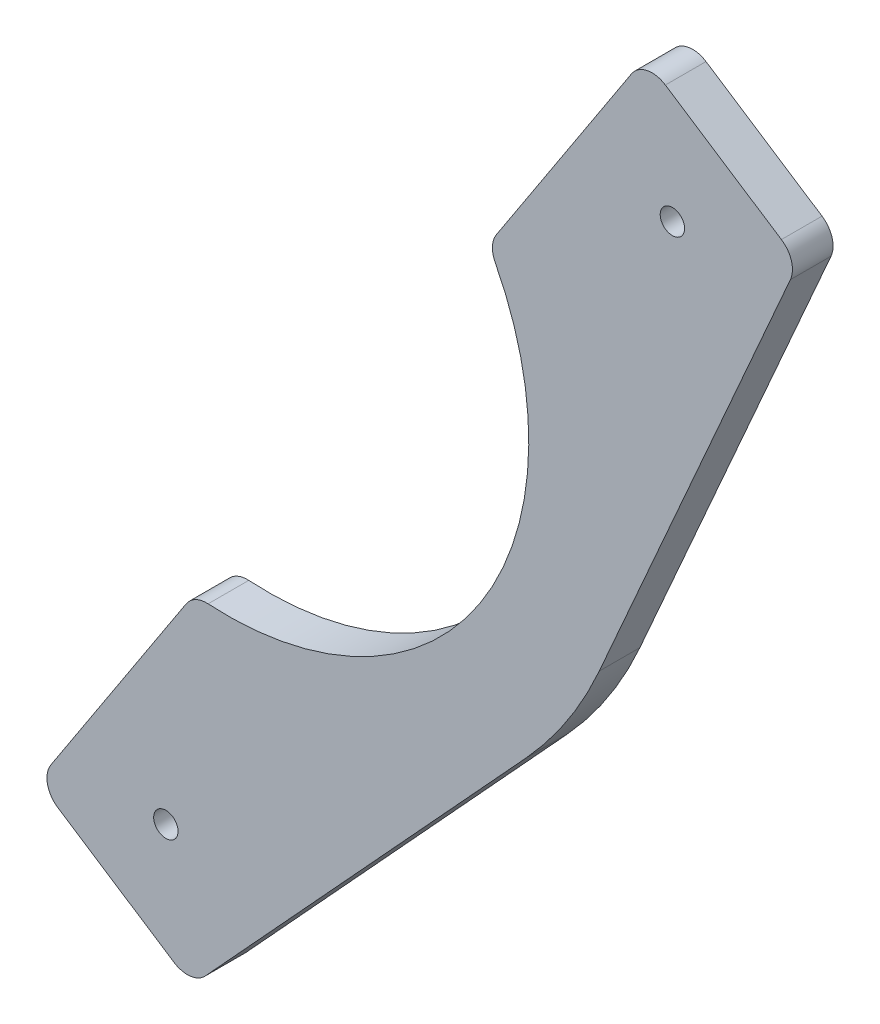
ISO-10303-21;
HEADER;
FILE_DESCRIPTION(('STEP AP214'),'2;1');
FILE_NAME('part.step','',(''),(''),'','','');
FILE_SCHEMA(('AUTOMOTIVE_DESIGN { 1 0 10303 214 1 1 1 1 }'));
ENDSEC;
DATA;
#1=APPLICATION_CONTEXT('core data for automotive mechanical design processes');
#2=APPLICATION_PROTOCOL_DEFINITION('international standard','automotive_design',2000,#1);
#3=PRODUCT_CONTEXT('',#1,'mechanical');
#4=PRODUCT('Part','Part','',(#3));
#5=PRODUCT_RELATED_PRODUCT_CATEGORY('part','',(#4));
#6=PRODUCT_DEFINITION_FORMATION('','',#4);
#7=PRODUCT_DEFINITION_CONTEXT('part definition',#1,'design');
#8=PRODUCT_DEFINITION('design','',#6,#7);
#9=PRODUCT_DEFINITION_SHAPE('','',#8);
#10=(LENGTH_UNIT() NAMED_UNIT(*) SI_UNIT(.MILLI.,.METRE.));
#11=(NAMED_UNIT(*) PLANE_ANGLE_UNIT() SI_UNIT($,.RADIAN.));
#12=(NAMED_UNIT(*) SI_UNIT($,.STERADIAN.) SOLID_ANGLE_UNIT());
#13=UNCERTAINTY_MEASURE_WITH_UNIT(LENGTH_MEASURE(1.E-05),#10,'distance_accuracy_value','');
#14=(GEOMETRIC_REPRESENTATION_CONTEXT(3) GLOBAL_UNCERTAINTY_ASSIGNED_CONTEXT((#13)) GLOBAL_UNIT_ASSIGNED_CONTEXT((#10,
#11,#12)) REPRESENTATION_CONTEXT('',''));
#15=CARTESIAN_POINT('',(0.,0.,0.));
#16=DIRECTION('',(0.,0.,1.));
#17=DIRECTION('',(1.,0.,0.));
#18=AXIS2_PLACEMENT_3D('',#15,#16,#17);
#19=CARTESIAN_POINT('',(-42.9886000873194,-65.7996407519994,5.));
#20=DIRECTION('',(0.546944138603989,0.837169104331222,0.));
#21=DIRECTION('',(-0.837169104331222,0.546944138603989,0.));
#22=AXIS2_PLACEMENT_3D('',#19,#20,#21);
#23=PLANE('',#22);
#24=DIRECTION('',(0.837169104331222,-0.546944138603989,0.));
#25=VECTOR('',#24,1.);
#26=CARTESIAN_POINT('',(-42.9886000873194,-65.7996407519994,0.));
#27=LINE('',#26,#25);
#28=CARTESIAN_POINT('',(-86.2942272599276,-37.506959108487,0.));
#29=VERTEX_POINT('',#28);
#30=CARTESIAN_POINT('',(-72.0136219777785,-46.8368463611088,0.));
#31=VERTEX_POINT('',#30);
#32=EDGE_CURVE('E173',#29,#31,#27,.T.);
#33=ORIENTED_EDGE('',*,*,#32,.T.);
#34=DIRECTION('',(0.,0.,-1.));
#35=VECTOR('',#34,1.);
#36=CARTESIAN_POINT('',(-72.0136219777785,-46.8368463611088,5.));
#37=LINE('',#36,#35);
#38=CARTESIAN_POINT('',(-72.0136219777785,-46.8368463611088,5.));
#39=VERTEX_POINT('',#38);
#40=EDGE_CURVE('E11',#39,#31,#37,.T.);
#41=ORIENTED_EDGE('',*,*,#40,.F.);
#42=DIRECTION('',(0.837169104331222,-0.546944138603989,0.));
#43=VECTOR('',#42,1.);
#44=CARTESIAN_POINT('',(-42.9886000873194,-65.7996407519994,5.));
#45=LINE('',#44,#43);
#46=CARTESIAN_POINT('',(-86.2942272599276,-37.506959108487,5.));
#47=VERTEX_POINT('',#46);
#48=EDGE_CURVE('E207',#47,#39,#45,.T.);
#49=ORIENTED_EDGE('',*,*,#48,.F.);
#50=DIRECTION('',(0.,0.,-1.));
#51=VECTOR('',#50,1.);
#52=CARTESIAN_POINT('',(-86.2942272599276,-37.506959108487,5.));
#53=LINE('',#52,#51);
#54=EDGE_CURVE('E172',#47,#29,#53,.T.);
#55=ORIENTED_EDGE('',*,*,#54,.T.);
#56=EDGE_LOOP('',(#33,#41,#49,#55));
#57=FACE_BOUND('',#56,.T.);
#58=ADVANCED_FACE('F35',(#57),#23,.F.);
#59=CARTESIAN_POINT('',(-70.3727895619665,-44.3253390481151,5.));
#60=DIRECTION('',(0.,0.,-1.));
#61=DIRECTION('',(-1.,0.,0.));
#62=AXIS2_PLACEMENT_3D('',#59,#60,#61);
#63=CYLINDRICAL_SURFACE('',#62,3.);
#64=CARTESIAN_POINT('',(-70.3727895619665,-44.3253390481151,0.));
#65=DIRECTION('',(0.,0.,1.));
#66=DIRECTION('',(1.,0.,0.));
#67=AXIS2_PLACEMENT_3D('',#64,#65,#66);
#68=CIRCLE('',#67,3.);
#69=CARTESIAN_POINT('',(-68.1635245012134,-46.3549074483756,0.));
#70=VERTEX_POINT('',#69);
#71=EDGE_CURVE('E176',#31,#70,#68,.T.);
#72=ORIENTED_EDGE('',*,*,#71,.T.);
#73=DIRECTION('',(0.,0.,-1.));
#74=VECTOR('',#73,1.);
#75=CARTESIAN_POINT('',(-68.1635245012134,-46.3549074483756,5.));
#76=LINE('',#75,#74);
#77=CARTESIAN_POINT('',(-68.1635245012134,-46.3549074483756,5.));
#78=VERTEX_POINT('',#77);
#79=EDGE_CURVE('E43',#78,#70,#76,.T.);
#80=ORIENTED_EDGE('',*,*,#79,.F.);
#81=CARTESIAN_POINT('',(-70.3727895619665,-44.3253390481151,5.));
#82=DIRECTION('',(0.,0.,1.));
#83=DIRECTION('',(1.,0.,0.));
#84=AXIS2_PLACEMENT_3D('',#81,#82,#83);
#85=CIRCLE('',#84,3.);
#86=EDGE_CURVE('E112',#39,#78,#85,.T.);
#87=ORIENTED_EDGE('',*,*,#86,.F.);
#88=ORIENTED_EDGE('',*,*,#40,.T.);
#89=EDGE_LOOP('',(#72,#80,#87,#88));
#90=FACE_BOUND('',#89,.T.);
#91=ADVANCED_FACE('F294',(#90),#63,.T.);
#92=CARTESIAN_POINT('',(-13.8719354868806,12.7436233952964,5.));
#93=DIRECTION('',(-0.736421686917699,0.676522800086805,0.));
#94=DIRECTION('',(-0.676522800086805,-0.736421686917699,0.));
#95=AXIS2_PLACEMENT_3D('',#92,#93,#94);
#96=PLANE('',#95);
#97=DIRECTION('',(0.676522800086805,0.736421686917699,0.));
#98=VECTOR('',#97,1.);
#99=CARTESIAN_POINT('',(-13.8719354868806,12.7436233952964,0.));
#100=LINE('',#99,#98);
#101=CARTESIAN_POINT('',(-28.6392294633598,-3.33115714421098,0.));
#102=VERTEX_POINT('',#101);
#103=EDGE_CURVE('E178',#70,#102,#100,.T.);
#104=ORIENTED_EDGE('',*,*,#103,.T.);
#105=DIRECTION('',(0.,0.,-1.));
#106=VECTOR('',#105,1.);
#107=CARTESIAN_POINT('',(-28.6392294633598,-3.33115714421098,5.));
#108=LINE('',#107,#106);
#109=CARTESIAN_POINT('',(-28.6392294633598,-3.33115714421098,5.));
#110=VERTEX_POINT('',#109);
#111=EDGE_CURVE('E231',#110,#102,#108,.T.);
#112=ORIENTED_EDGE('',*,*,#111,.F.);
#113=DIRECTION('',(0.676522800086805,0.736421686917699,0.));
#114=VECTOR('',#113,1.);
#115=CARTESIAN_POINT('',(-13.8719354868806,12.7436233952964,5.));
#116=LINE('',#115,#114);
#117=EDGE_CURVE('E239',#78,#110,#116,.T.);
#118=ORIENTED_EDGE('',*,*,#117,.F.);
#119=ORIENTED_EDGE('',*,*,#79,.T.);
#120=EDGE_LOOP('',(#104,#112,#118,#119));
#121=FACE_BOUND('',#120,.T.);
#122=ADVANCED_FACE('F237',(#121),#96,.F.);
#123=CARTESIAN_POINT('',(-65.4603138092448,30.4949828601293,5.));
#124=DIRECTION('',(0.,0.,-1.));
#125=DIRECTION('',(-1.,0.,0.));
#126=AXIS2_PLACEMENT_3D('',#123,#124,#125);
#127=CYLINDRICAL_SURFACE('',#126,50.);
#128=CARTESIAN_POINT('',(-65.4603138092448,30.4949828601293,0.));
#129=DIRECTION('',(0.,0.,1.));
#130=DIRECTION('',(1.,0.,0.));
#131=AXIS2_PLACEMENT_3D('',#128,#129,#130);
#132=CIRCLE('',#131,50.);
#133=CARTESIAN_POINT('',(-19.6921826188176,10.3634611258975,0.));
#134=VERTEX_POINT('',#133);
#135=EDGE_CURVE('E180',#102,#134,#132,.T.);
#136=ORIENTED_EDGE('',*,*,#135,.T.);
#137=DIRECTION('',(0.,0.,-1.));
#138=VECTOR('',#137,1.);
#139=CARTESIAN_POINT('',(-19.6921826188176,10.3634611258975,5.));
#140=LINE('',#139,#138);
#141=CARTESIAN_POINT('',(-19.6921826188176,10.3634611258975,5.));
#142=VERTEX_POINT('',#141);
#143=EDGE_CURVE('E228',#142,#134,#140,.T.);
#144=ORIENTED_EDGE('',*,*,#143,.F.);
#145=CARTESIAN_POINT('',(-65.4603138092448,30.4949828601293,5.));
#146=DIRECTION('',(0.,0.,1.));
#147=DIRECTION('',(1.,0.,0.));
#148=AXIS2_PLACEMENT_3D('',#145,#146,#147);
#149=CIRCLE('',#148,50.);
#150=EDGE_CURVE('E258',#110,#142,#149,.T.);
#151=ORIENTED_EDGE('',*,*,#150,.F.);
#152=ORIENTED_EDGE('',*,*,#111,.T.);
#153=EDGE_LOOP('',(#136,#144,#151,#152));
#154=FACE_BOUND('',#153,.T.);
#155=ADVANCED_FACE('F249',(#154),#127,.T.);
#156=CARTESIAN_POINT('',(-20.3193410911798,8.93764386184757,5.));
#157=DIRECTION('',(-0.915362623808544,0.402630434684635,0.));
#158=DIRECTION('',(-0.402630434684635,-0.915362623808544,0.));
#159=AXIS2_PLACEMENT_3D('',#156,#157,#158);
#160=PLANE('',#159);
#161=DIRECTION('',(0.402630434684635,0.915362623808544,0.));
#162=VECTOR('',#161,1.);
#163=CARTESIAN_POINT('',(-20.3193410911798,8.93764386184757,0.));
#164=LINE('',#163,#162);
#165=CARTESIAN_POINT('',(3.83057831348635,63.8414258085224,0.));
#166=VERTEX_POINT('',#165);
#167=EDGE_CURVE('E182',#134,#166,#164,.T.);
#168=ORIENTED_EDGE('',*,*,#167,.T.);
#169=DIRECTION('',(0.,0.,-1.));
#170=VECTOR('',#169,1.);
#171=CARTESIAN_POINT('',(3.83057831348635,63.8414258085224,5.));
#172=LINE('',#171,#170);
#173=CARTESIAN_POINT('',(3.83057831348635,63.8414258085224,5.));
#174=VERTEX_POINT('',#173);
#175=EDGE_CURVE('E225',#174,#166,#172,.T.);
#176=ORIENTED_EDGE('',*,*,#175,.F.);
#177=DIRECTION('',(0.402630434684635,0.915362623808544,0.));
#178=VECTOR('',#177,1.);
#179=CARTESIAN_POINT('',(-20.3193410911798,8.93764386184757,5.));
#180=LINE('',#179,#178);
#181=EDGE_CURVE('E255',#142,#174,#180,.T.);
#182=ORIENTED_EDGE('',*,*,#181,.F.);
#183=ORIENTED_EDGE('',*,*,#143,.T.);
#184=EDGE_LOOP('',(#168,#176,#182,#183));
#185=FACE_BOUND('',#184,.T.);
#186=ADVANCED_FACE('F253',(#185),#160,.F.);
#187=CARTESIAN_POINT('',(1.08449044206071,65.0493171125763,5.));
#188=DIRECTION('',(0.,0.,-1.));
#189=DIRECTION('',(-1.,0.,0.));
#190=AXIS2_PLACEMENT_3D('',#187,#188,#189);
#191=CYLINDRICAL_SURFACE('',#190,3.);
#192=CARTESIAN_POINT('',(1.08449044206071,65.0493171125763,0.));
#193=DIRECTION('',(0.,0.,1.));
#194=DIRECTION('',(1.,0.,0.));
#195=AXIS2_PLACEMENT_3D('',#192,#193,#194);
#196=CIRCLE('',#195,3.);
#197=CARTESIAN_POINT('',(2.72532285787266,67.5608244255699,0.));
#198=VERTEX_POINT('',#197);
#199=EDGE_CURVE('E184',#166,#198,#196,.T.);
#200=ORIENTED_EDGE('',*,*,#199,.T.);
#201=DIRECTION('',(0.,0.,-1.));
#202=VECTOR('',#201,1.);
#203=CARTESIAN_POINT('',(2.72532285787266,67.5608244255699,5.));
#204=LINE('',#203,#202);
#205=CARTESIAN_POINT('',(2.72532285787266,67.5608244255699,5.));
#206=VERTEX_POINT('',#205);
#207=EDGE_CURVE('E222',#206,#198,#204,.T.);
#208=ORIENTED_EDGE('',*,*,#207,.F.);
#209=CARTESIAN_POINT('',(1.08449044206071,65.0493171125763,5.));
#210=DIRECTION('',(0.,0.,1.));
#211=DIRECTION('',(1.,0.,0.));
#212=AXIS2_PLACEMENT_3D('',#209,#210,#211);
#213=CIRCLE('',#212,3.);
#214=EDGE_CURVE('E257',#174,#206,#213,.T.);
#215=ORIENTED_EDGE('',*,*,#214,.F.);
#216=ORIENTED_EDGE('',*,*,#175,.T.);
#217=EDGE_LOOP('',(#200,#208,#215,#216));
#218=FACE_BOUND('',#217,.T.);
#219=ADVANCED_FACE('F307',(#218),#191,.T.);
#220=CARTESIAN_POINT('',(31.7503447483318,48.5980300346792,5.));
#221=DIRECTION('',(-0.546944138603989,-0.837169104331222,0.));
#222=DIRECTION('',(0.837169104331222,-0.546944138603989,0.));
#223=AXIS2_PLACEMENT_3D('',#220,#221,#222);
#224=PLANE('',#223);
#225=DIRECTION('',(-0.837169104331222,0.546944138603989,0.));
#226=VECTOR('',#225,1.);
#227=CARTESIAN_POINT('',(31.7503447483318,48.5980300346792,0.));
#228=LINE('',#227,#226);
#229=CARTESIAN_POINT('',(-11.5552824242765,76.8907116781917,0.));
#230=VERTEX_POINT('',#229);
#231=EDGE_CURVE('E186',#198,#230,#228,.T.);
#232=ORIENTED_EDGE('',*,*,#231,.T.);
#233=DIRECTION('',(0.,0.,-1.));
#234=VECTOR('',#233,1.);
#235=CARTESIAN_POINT('',(-11.5552824242765,76.8907116781917,5.));
#236=LINE('',#235,#234);
#237=CARTESIAN_POINT('',(-11.5552824242765,76.8907116781917,5.));
#238=VERTEX_POINT('',#237);
#239=EDGE_CURVE('E219',#238,#230,#236,.T.);
#240=ORIENTED_EDGE('',*,*,#239,.F.);
#241=DIRECTION('',(-0.837169104331222,0.546944138603989,0.));
#242=VECTOR('',#241,1.);
#243=CARTESIAN_POINT('',(31.7503447483318,48.5980300346792,5.));
#244=LINE('',#243,#242);
#245=EDGE_CURVE('E260',#206,#238,#244,.T.);
#246=ORIENTED_EDGE('',*,*,#245,.F.);
#247=ORIENTED_EDGE('',*,*,#207,.T.);
#248=EDGE_LOOP('',(#232,#240,#246,#247));
#249=FACE_BOUND('',#248,.T.);
#250=ADVANCED_FACE('F310',(#249),#224,.F.);
#251=CARTESIAN_POINT('',(-13.1961148400884,74.379204365198,5.));
#252=DIRECTION('',(0.,0.,-1.));
#253=DIRECTION('',(-1.,0.,0.));
#254=AXIS2_PLACEMENT_3D('',#251,#252,#253);
#255=CYLINDRICAL_SURFACE('',#254,3.);
#256=CARTESIAN_POINT('',(-13.1961148400884,74.379204365198,0.));
#257=DIRECTION('',(0.,0.,1.));
#258=DIRECTION('',(1.,0.,0.));
#259=AXIS2_PLACEMENT_3D('',#256,#257,#258);
#260=CIRCLE('',#259,3.);
#261=CARTESIAN_POINT('',(-15.7076221530821,76.02003678101,0.));
#262=VERTEX_POINT('',#261);
#263=EDGE_CURVE('E188',#230,#262,#260,.T.);
#264=ORIENTED_EDGE('',*,*,#263,.T.);
#265=DIRECTION('',(0.,0.,-1.));
#266=VECTOR('',#265,1.);
#267=CARTESIAN_POINT('',(-15.7076221530821,76.02003678101,5.));
#268=LINE('',#267,#266);
#269=CARTESIAN_POINT('',(-15.7076221530821,76.02003678101,5.));
#270=VERTEX_POINT('',#269);
#271=EDGE_CURVE('E216',#270,#262,#268,.T.);
#272=ORIENTED_EDGE('',*,*,#271,.F.);
#273=CARTESIAN_POINT('',(-13.1961148400884,74.379204365198,5.));
#274=DIRECTION('',(0.,0.,1.));
#275=DIRECTION('',(1.,0.,0.));
#276=AXIS2_PLACEMENT_3D('',#273,#274,#275);
#277=CIRCLE('',#276,3.);
#278=EDGE_CURVE('E266',#238,#270,#277,.T.);
#279=ORIENTED_EDGE('',*,*,#278,.F.);
#280=ORIENTED_EDGE('',*,*,#239,.T.);
#281=EDGE_LOOP('',(#264,#272,#279,#280));
#282=FACE_BOUND('',#281,.T.);
#283=ADVANCED_FACE('F314',(#282),#255,.T.);
#284=CARTESIAN_POINT('',(-45.8171344856019,29.9335140593244,5.));
#285=DIRECTION('',(0.837169104331222,-0.546944138603989,0.));
#286=DIRECTION('',(0.546944138603989,0.837169104331222,0.));
#287=AXIS2_PLACEMENT_3D('',#284,#285,#286);
#288=PLANE('',#287);
#289=DIRECTION('',(-0.546944138603989,-0.837169104331222,0.));
#290=VECTOR('',#289,1.);
#291=CARTESIAN_POINT('',(-45.8171344856019,29.9335140593244,0.));
#292=LINE('',#291,#290);
#293=CARTESIAN_POINT('',(-32.3489446868555,50.5483293484286,0.));
#294=VERTEX_POINT('',#293);
#295=EDGE_CURVE('E190',#262,#294,#292,.T.);
#296=ORIENTED_EDGE('',*,*,#295,.T.);
#297=DIRECTION('',(0.,0.,-1.));
#298=VECTOR('',#297,1.);
#299=CARTESIAN_POINT('',(-32.3489446868555,50.5483293484286,5.));
#300=LINE('',#299,#298);
#301=CARTESIAN_POINT('',(-32.3489446868555,50.5483293484286,5.));
#302=VERTEX_POINT('',#301);
#303=EDGE_CURVE('E213',#302,#294,#300,.T.);
#304=ORIENTED_EDGE('',*,*,#303,.F.);
#305=DIRECTION('',(-0.546944138603989,-0.837169104331222,0.));
#306=VECTOR('',#305,1.);
#307=CARTESIAN_POINT('',(-45.8171344856019,29.9335140593244,5.));
#308=LINE('',#307,#306);
#309=EDGE_CURVE('E268',#270,#302,#308,.T.);
#310=ORIENTED_EDGE('',*,*,#309,.F.);
#311=ORIENTED_EDGE('',*,*,#271,.T.);
#312=EDGE_LOOP('',(#296,#304,#310,#311));
#313=FACE_BOUND('',#312,.T.);
#314=ADVANCED_FACE('F318',(#313),#288,.F.);
#315=CARTESIAN_POINT('',(-29.8374373738618,48.9074969326166,5.));
#316=DIRECTION('',(0.,0.,-1.));
#317=DIRECTION('',(-1.,0.,0.));
#318=AXIS2_PLACEMENT_3D('',#315,#316,#317);
#319=CYLINDRICAL_SURFACE('',#318,3.);
#320=CARTESIAN_POINT('',(-29.8374373738618,48.9074969326166,0.));
#321=DIRECTION('',(0.,0.,1.));
#322=DIRECTION('',(1.,0.,0.));
#323=AXIS2_PLACEMENT_3D('',#320,#321,#322);
#324=CIRCLE('',#323,3.);
#325=CARTESIAN_POINT('',(-32.5024904737657,47.5300021142261,0.));
#326=VERTEX_POINT('',#325);
#327=EDGE_CURVE('E192',#294,#326,#324,.T.);
#328=ORIENTED_EDGE('',*,*,#327,.T.);
#329=DIRECTION('',(0.,0.,-1.));
#330=VECTOR('',#329,1.);
#331=CARTESIAN_POINT('',(-32.5024904737657,47.5300021142261,5.));
#332=LINE('',#331,#330);
#333=CARTESIAN_POINT('',(-32.5024904737657,47.5300021142261,5.));
#334=VERTEX_POINT('',#333);
#335=EDGE_CURVE('E211',#334,#326,#332,.T.);
#336=ORIENTED_EDGE('',*,*,#335,.F.);
#337=CARTESIAN_POINT('',(-29.8374373738618,48.9074969326166,5.));
#338=DIRECTION('',(0.,0.,1.));
#339=DIRECTION('',(1.,0.,0.));
#340=AXIS2_PLACEMENT_3D('',#337,#338,#339);
#341=CIRCLE('',#340,3.);
#342=EDGE_CURVE('E270',#302,#334,#341,.T.);
#343=ORIENTED_EDGE('',*,*,#342,.F.);
#344=ORIENTED_EDGE('',*,*,#303,.T.);
#345=EDGE_LOOP('',(#328,#336,#343,#344));
#346=FACE_BOUND('',#345,.T.);
#347=ADVANCED_FACE('F322',(#346),#319,.T.);
#348=CARTESIAN_POINT('',(-65.4603138092448,30.4949828601293,5.));
#349=DIRECTION('',(0.,0.,-1.));
#350=DIRECTION('',(-1.,0.,0.));
#351=AXIS2_PLACEMENT_3D('',#348,#349,#350);
#352=CYLINDRICAL_SURFACE('',#351,37.1000000000014);
#353=CARTESIAN_POINT('',(-65.4603138092448,30.4949828601293,0.));
#354=DIRECTION('',(0.,0.,1.));
#355=DIRECTION('',(1.,0.,0.));
#356=AXIS2_PLACEMENT_3D('',#353,#354,#355);
#357=CIRCLE('',#356,37.1000000000014);
#358=CARTESIAN_POINT('',(-67.821167684325,-6.52982462053995,0.));
#359=VERTEX_POINT('',#358);
#360=EDGE_CURVE('E195',#359,#326,#357,.T.);
#361=ORIENTED_EDGE('',*,*,#360,.F.);
#362=DIRECTION('',(0.,0.,-1.));
#363=VECTOR('',#362,1.);
#364=CARTESIAN_POINT('',(-67.821167684325,-6.52982462053995,5.));
#365=LINE('',#364,#363);
#366=CARTESIAN_POINT('',(-67.821167684325,-6.52982462053995,5.));
#367=VERTEX_POINT('',#366);
#368=EDGE_CURVE('E158',#367,#359,#365,.T.);
#369=ORIENTED_EDGE('',*,*,#368,.F.);
#370=CARTESIAN_POINT('',(-65.4603138092448,30.4949828601293,5.));
#371=DIRECTION('',(0.,0.,1.));
#372=DIRECTION('',(1.,0.,0.));
#373=AXIS2_PLACEMENT_3D('',#370,#371,#372);
#374=CIRCLE('',#373,37.1000000000014);
#375=EDGE_CURVE('E151',#367,#334,#374,.T.);
#376=ORIENTED_EDGE('',*,*,#375,.T.);
#377=ORIENTED_EDGE('',*,*,#335,.T.);
#378=EDGE_LOOP('',(#361,#369,#376,#377));
#379=FACE_BOUND('',#378,.T.);
#380=ADVANCED_FACE('F273',(#379),#352,.F.);
#381=CARTESIAN_POINT('',(-68.0120723103422,-9.52374436291204,5.));
#382=DIRECTION('',(0.,0.,-1.));
#383=DIRECTION('',(-1.,0.,0.));
#384=AXIS2_PLACEMENT_3D('',#381,#382,#383);
#385=CYLINDRICAL_SURFACE('',#384,3.);
#386=CARTESIAN_POINT('',(-68.0120723103422,-9.52374436291204,0.));
#387=DIRECTION('',(0.,0.,1.));
#388=DIRECTION('',(1.,0.,0.));
#389=AXIS2_PLACEMENT_3D('',#386,#387,#388);
#390=CIRCLE('',#389,3.);
#391=CARTESIAN_POINT('',(-70.5235796233359,-7.88291194710006,0.));
#392=VERTEX_POINT('',#391);
#393=EDGE_CURVE('E157',#359,#392,#390,.T.);
#394=ORIENTED_EDGE('',*,*,#393,.T.);
#395=DIRECTION('',(0.,0.,-1.));
#396=VECTOR('',#395,1.);
#397=CARTESIAN_POINT('',(-70.5235796233359,-7.88291194710006,5.));
#398=LINE('',#397,#396);
#399=CARTESIAN_POINT('',(-70.5235796233359,-7.88291194710006,5.));
#400=VERTEX_POINT('',#399);
#401=EDGE_CURVE('E154',#400,#392,#398,.T.);
#402=ORIENTED_EDGE('',*,*,#401,.F.);
#403=CARTESIAN_POINT('',(-68.0120723103422,-9.52374436291204,5.));
#404=DIRECTION('',(0.,0.,1.));
#405=DIRECTION('',(1.,0.,0.));
#406=AXIS2_PLACEMENT_3D('',#403,#404,#405);
#407=CIRCLE('',#406,3.);
#408=EDGE_CURVE('E144',#367,#400,#407,.T.);
#409=ORIENTED_EDGE('',*,*,#408,.F.);
#410=ORIENTED_EDGE('',*,*,#368,.T.);
#411=EDGE_LOOP('',(#394,#402,#409,#410));
#412=FACE_BOUND('',#411,.T.);
#413=ADVANCED_FACE('F155',(#412),#385,.T.);
#414=CARTESIAN_POINT('',(-45.8171344856019,29.9335140593244,5.));
#415=DIRECTION('',(0.837169104331222,-0.546944138603989,0.));
#416=DIRECTION('',(0.546944138603989,0.837169104331222,0.));
#417=AXIS2_PLACEMENT_3D('',#414,#415,#416);
#418=PLANE('',#417);
#419=DIRECTION('',(-0.546944138603989,-0.837169104331222,0.));
#420=VECTOR('',#419,1.);
#421=CARTESIAN_POINT('',(-45.8171344856019,29.9335140593244,0.));
#422=LINE('',#421,#420);
#423=CARTESIAN_POINT('',(-87.1649021571093,-33.3546193796814,0.));
#424=VERTEX_POINT('',#423);
#425=EDGE_CURVE('E98',#392,#424,#422,.T.);
#426=ORIENTED_EDGE('',*,*,#425,.T.);
#427=DIRECTION('',(0.,0.,-1.));
#428=VECTOR('',#427,1.);
#429=CARTESIAN_POINT('',(-87.1649021571093,-33.3546193796814,5.));
#430=LINE('',#429,#428);
#431=CARTESIAN_POINT('',(-87.1649021571093,-33.3546193796814,5.));
#432=VERTEX_POINT('',#431);
#433=EDGE_CURVE('E159',#432,#424,#430,.T.);
#434=ORIENTED_EDGE('',*,*,#433,.F.);
#435=DIRECTION('',(-0.546944138603989,-0.837169104331222,0.));
#436=VECTOR('',#435,1.);
#437=CARTESIAN_POINT('',(-45.8171344856019,29.9335140593244,5.));
#438=LINE('',#437,#436);
#439=EDGE_CURVE('E149',#400,#432,#438,.T.);
#440=ORIENTED_EDGE('',*,*,#439,.F.);
#441=ORIENTED_EDGE('',*,*,#401,.T.);
#442=EDGE_LOOP('',(#426,#434,#440,#441));
#443=FACE_BOUND('',#442,.T.);
#444=ADVANCED_FACE('F161',(#443),#418,.F.);
#445=CARTESIAN_POINT('',(-73.020492870944,-32.6300911400839,5.));
#446=DIRECTION('',(0.,0.,-1.));
#447=DIRECTION('',(-1.,0.,0.));
#448=AXIS2_PLACEMENT_3D('',#445,#446,#447);
#449=CYLINDRICAL_SURFACE('',#448,1.50000000000001);
#450=CARTESIAN_POINT('',(-73.020492870944,-32.6300911400839,5.));
#451=DIRECTION('',(0.,0.,1.));
#452=DIRECTION('',(1.,0.,0.));
#453=AXIS2_PLACEMENT_3D('',#450,#451,#452);
#454=CIRCLE('',#453,1.50000000000001);
#455=CARTESIAN_POINT('',(-71.5204928709439,-32.6300911400839,5.));
#456=VERTEX_POINT('',#455);
#457=EDGE_CURVE('E163',#456,#456,#454,.F.);
#458=ORIENTED_EDGE('',*,*,#457,.F.);
#459=EDGE_LOOP('',(#458));
#460=FACE_BOUND('',#459,.T.);
#461=CARTESIAN_POINT('',(-73.020492870944,-32.6300911400839,0.));
#462=DIRECTION('',(0.,0.,1.));
#463=DIRECTION('',(1.,0.,0.));
#464=AXIS2_PLACEMENT_3D('',#461,#462,#463);
#465=CIRCLE('',#464,1.50000000000001);
#466=CARTESIAN_POINT('',(-71.5204928709439,-32.6300911400839,0.));
#467=VERTEX_POINT('',#466);
#468=EDGE_CURVE('E201',#467,#467,#465,.F.);
#469=ORIENTED_EDGE('',*,*,#468,.T.);
#470=EDGE_LOOP('',(#469));
#471=FACE_BOUND('',#470,.T.);
#472=ADVANCED_FACE('F282',(#460,#471),#449,.F.);
#473=CARTESIAN_POINT('',(-84.6533948441156,-34.9954517954934,5.));
#474=DIRECTION('',(0.,0.,-1.));
#475=DIRECTION('',(-1.,0.,0.));
#476=AXIS2_PLACEMENT_3D('',#473,#474,#475);
#477=CYLINDRICAL_SURFACE('',#476,2.99999999999999);
#478=CARTESIAN_POINT('',(-84.6533948441156,-34.9954517954934,0.));
#479=DIRECTION('',(0.,0.,1.));
#480=DIRECTION('',(1.,0.,0.));
#481=AXIS2_PLACEMENT_3D('',#478,#479,#480);
#482=CIRCLE('',#481,2.99999999999999);
#483=EDGE_CURVE('E104',#424,#29,#482,.T.);
#484=ORIENTED_EDGE('',*,*,#483,.T.);
#485=ORIENTED_EDGE('',*,*,#54,.F.);
#486=CARTESIAN_POINT('',(-84.6533948441156,-34.9954517954934,5.));
#487=DIRECTION('',(0.,0.,1.));
#488=DIRECTION('',(1.,0.,0.));
#489=AXIS2_PLACEMENT_3D('',#486,#487,#488);
#490=CIRCLE('',#489,2.99999999999999);
#491=EDGE_CURVE('E51',#432,#47,#490,.T.);
#492=ORIENTED_EDGE('',*,*,#491,.F.);
#493=ORIENTED_EDGE('',*,*,#433,.T.);
#494=EDGE_LOOP('',(#484,#485,#492,#493));
#495=FACE_BOUND('',#494,.T.);
#496=ADVANCED_FACE('F279',(#495),#477,.T.);
#497=CARTESIAN_POINT('',(-10.6892541161775,62.7759725456361,5.));
#498=DIRECTION('',(0.,0.,-1.));
#499=DIRECTION('',(-1.,0.,0.));
#500=AXIS2_PLACEMENT_3D('',#497,#498,#499);
#501=CYLINDRICAL_SURFACE('',#500,1.5);
#502=CARTESIAN_POINT('',(-10.6892541161775,62.7759725456361,5.));
#503=DIRECTION('',(0.,0.,1.));
#504=DIRECTION('',(1.,0.,0.));
#505=AXIS2_PLACEMENT_3D('',#502,#503,#504);
#506=CIRCLE('',#505,1.5);
#507=CARTESIAN_POINT('',(-9.18925411617745,62.7759725456361,5.));
#508=VERTEX_POINT('',#507);
#509=EDGE_CURVE('E169',#508,#508,#506,.T.);
#510=ORIENTED_EDGE('',*,*,#509,.T.);
#511=EDGE_LOOP('',(#510));
#512=FACE_BOUND('',#511,.T.);
#513=CARTESIAN_POINT('',(-10.6892541161775,62.7759725456361,0.));
#514=DIRECTION('',(0.,0.,1.));
#515=DIRECTION('',(1.,0.,0.));
#516=AXIS2_PLACEMENT_3D('',#513,#514,#515);
#517=CIRCLE('',#516,1.5);
#518=CARTESIAN_POINT('',(-9.18925411617745,62.7759725456361,0.));
#519=VERTEX_POINT('',#518);
#520=EDGE_CURVE('E204',#519,#519,#517,.T.);
#521=ORIENTED_EDGE('',*,*,#520,.F.);
#522=EDGE_LOOP('',(#521));
#523=FACE_BOUND('',#522,.T.);
#524=ADVANCED_FACE('F281',(#512,#523),#501,.F.);
#525=CARTESIAN_POINT('',(0.,0.,5.));
#526=DIRECTION('',(0.,0.,1.));
#527=DIRECTION('',(1.,0.,0.));
#528=AXIS2_PLACEMENT_3D('',#525,#526,#527);
#529=PLANE('',#528);
#530=ORIENTED_EDGE('',*,*,#48,.T.);
#531=ORIENTED_EDGE('',*,*,#86,.T.);
#532=ORIENTED_EDGE('',*,*,#117,.T.);
#533=ORIENTED_EDGE('',*,*,#150,.T.);
#534=ORIENTED_EDGE('',*,*,#181,.T.);
#535=ORIENTED_EDGE('',*,*,#214,.T.);
#536=ORIENTED_EDGE('',*,*,#245,.T.);
#537=ORIENTED_EDGE('',*,*,#278,.T.);
#538=ORIENTED_EDGE('',*,*,#309,.T.);
#539=ORIENTED_EDGE('',*,*,#342,.T.);
#540=ORIENTED_EDGE('',*,*,#375,.F.);
#541=ORIENTED_EDGE('',*,*,#408,.T.);
#542=ORIENTED_EDGE('',*,*,#439,.T.);
#543=ORIENTED_EDGE('',*,*,#491,.T.);
#544=EDGE_LOOP('',(#530,#531,#532,#533,#534,#535,#536,#537,#538,#539,#540,#541,#542,#543));
#545=FACE_BOUND('',#544,.T.);
#546=ORIENTED_EDGE('',*,*,#457,.T.);
#547=EDGE_LOOP('',(#546));
#548=FACE_BOUND('',#547,.T.);
#549=ORIENTED_EDGE('',*,*,#509,.F.);
#550=EDGE_LOOP('',(#549));
#551=FACE_BOUND('',#550,.T.);
#552=ADVANCED_FACE('F146',(#545,#548,#551),#529,.T.);
#553=CARTESIAN_POINT('',(0.,0.,0.));
#554=DIRECTION('',(0.,0.,1.));
#555=DIRECTION('',(1.,0.,0.));
#556=AXIS2_PLACEMENT_3D('',#553,#554,#555);
#557=PLANE('',#556);
#558=ORIENTED_EDGE('',*,*,#32,.F.);
#559=ORIENTED_EDGE('',*,*,#483,.F.);
#560=ORIENTED_EDGE('',*,*,#425,.F.);
#561=ORIENTED_EDGE('',*,*,#393,.F.);
#562=ORIENTED_EDGE('',*,*,#360,.T.);
#563=ORIENTED_EDGE('',*,*,#327,.F.);
#564=ORIENTED_EDGE('',*,*,#295,.F.);
#565=ORIENTED_EDGE('',*,*,#263,.F.);
#566=ORIENTED_EDGE('',*,*,#231,.F.);
#567=ORIENTED_EDGE('',*,*,#199,.F.);
#568=ORIENTED_EDGE('',*,*,#167,.F.);
#569=ORIENTED_EDGE('',*,*,#135,.F.);
#570=ORIENTED_EDGE('',*,*,#103,.F.);
#571=ORIENTED_EDGE('',*,*,#71,.F.);
#572=EDGE_LOOP('',(#558,#559,#560,#561,#562,#563,#564,#565,#566,#567,#568,#569,#570,#571));
#573=FACE_BOUND('',#572,.T.);
#574=ORIENTED_EDGE('',*,*,#468,.F.);
#575=EDGE_LOOP('',(#574));
#576=FACE_BOUND('',#575,.T.);
#577=ORIENTED_EDGE('',*,*,#520,.T.);
#578=EDGE_LOOP('',(#577));
#579=FACE_BOUND('',#578,.T.);
#580=ADVANCED_FACE('F243',(#573,#576,#579),#557,.F.);
#581=CLOSED_SHELL('',(#58,#91,#122,#155,#186,#219,#250,#283,#314,#347,#380,#413,#444,#472,#496,
#524,#552,#580));
#582=MANIFOLD_SOLID_BREP('B2',#581);
#583=ADVANCED_BREP_SHAPE_REPRESENTATION('',(#18,#582),#14);
#584=SHAPE_DEFINITION_REPRESENTATION(#9,#583);
ENDSEC;
END-ISO-10303-21;
